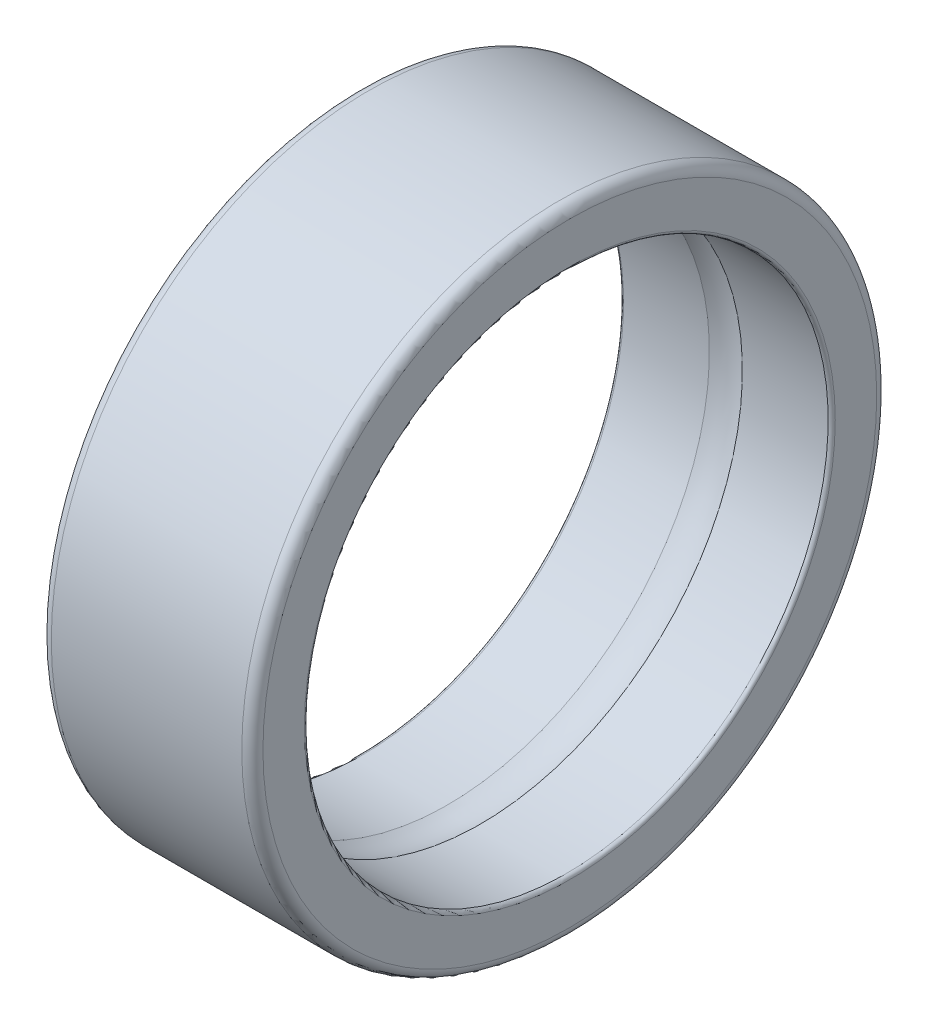
ISO-10303-21;
HEADER;
FILE_DESCRIPTION(('STEP AP214'),'2;1');
FILE_NAME('part.step','',(''),(''),'','','');
FILE_SCHEMA(('AUTOMOTIVE_DESIGN { 1 0 10303 214 1 1 1 1 }'));
ENDSEC;
DATA;
#1=APPLICATION_CONTEXT('core data for automotive mechanical design processes');
#2=APPLICATION_PROTOCOL_DEFINITION('international standard','automotive_design',2000,#1);
#3=PRODUCT_CONTEXT('',#1,'mechanical');
#4=PRODUCT('Part','Part','',(#3));
#5=PRODUCT_RELATED_PRODUCT_CATEGORY('part','',(#4));
#6=PRODUCT_DEFINITION_FORMATION('','',#4);
#7=PRODUCT_DEFINITION_CONTEXT('part definition',#1,'design');
#8=PRODUCT_DEFINITION('design','',#6,#7);
#9=PRODUCT_DEFINITION_SHAPE('','',#8);
#10=(LENGTH_UNIT() NAMED_UNIT(*) SI_UNIT(.MILLI.,.METRE.));
#11=(NAMED_UNIT(*) PLANE_ANGLE_UNIT() SI_UNIT($,.RADIAN.));
#12=(NAMED_UNIT(*) SI_UNIT($,.STERADIAN.) SOLID_ANGLE_UNIT());
#13=UNCERTAINTY_MEASURE_WITH_UNIT(LENGTH_MEASURE(1.E-05),#10,'distance_accuracy_value','');
#14=(GEOMETRIC_REPRESENTATION_CONTEXT(3) GLOBAL_UNCERTAINTY_ASSIGNED_CONTEXT((#13)) GLOBAL_UNIT_ASSIGNED_CONTEXT((#10,
#11,#12)) REPRESENTATION_CONTEXT('',''));
#15=CARTESIAN_POINT('',(0.,0.,0.));
#16=DIRECTION('',(0.,0.,1.));
#17=DIRECTION('',(1.,0.,0.));
#18=AXIS2_PLACEMENT_3D('',#15,#16,#17);
#19=CARTESIAN_POINT('',(0.0666666666667272,0.,0.));
#20=DIRECTION('',(-1.,0.,0.));
#21=DIRECTION('',(0.,0.,1.));
#22=AXIS2_PLACEMENT_3D('',#19,#20,#21);
#23=TOROIDAL_SURFACE('',#22,5.01666666666673,0.0666666666667271);
#24=CARTESIAN_POINT('',(0.0666666666666671,0.,0.));
#25=DIRECTION('',(-1.,0.,0.));
#26=DIRECTION('',(0.,0.,1.));
#27=AXIS2_PLACEMENT_3D('',#24,#25,#26);
#28=CIRCLE('',#27,4.95);
#29=CARTESIAN_POINT('',(0.0666666666666671,0.,4.95));
#30=VERTEX_POINT('',#29);
#31=EDGE_CURVE('E10',#30,#30,#28,.T.);
#32=ORIENTED_EDGE('',*,*,#31,.F.);
#33=EDGE_LOOP('',(#32));
#34=FACE_BOUND('',#33,.T.);
#35=CARTESIAN_POINT('',(0.,0.,0.));
#36=DIRECTION('',(-1.,0.,0.));
#37=DIRECTION('',(0.,0.,1.));
#38=AXIS2_PLACEMENT_3D('',#35,#36,#37);
#39=CIRCLE('',#38,5.0166666666667);
#40=CARTESIAN_POINT('',(0.,0.,5.0166666666667));
#41=VERTEX_POINT('',#40);
#42=EDGE_CURVE('E65',#41,#41,#39,.T.);
#43=ORIENTED_EDGE('',*,*,#42,.T.);
#44=EDGE_LOOP('',(#43));
#45=FACE_BOUND('',#44,.T.);
#46=ADVANCED_FACE('F31',(#34,#45),#23,.T.);
#47=CARTESIAN_POINT('',(4.,0.,0.));
#48=DIRECTION('',(-1.,0.,0.));
#49=DIRECTION('',(0.,0.,1.));
#50=AXIS2_PLACEMENT_3D('',#47,#48,#49);
#51=CYLINDRICAL_SURFACE('',#50,4.95);
#52=CARTESIAN_POINT('',(1.6877501000801,0.,0.));
#53=DIRECTION('',(-1.,0.,0.));
#54=DIRECTION('',(0.,0.,1.));
#55=AXIS2_PLACEMENT_3D('',#52,#53,#54);
#56=CIRCLE('',#55,4.95);
#57=CARTESIAN_POINT('',(1.6877501000801,0.,4.95));
#58=VERTEX_POINT('',#57);
#59=EDGE_CURVE('E37',#58,#58,#56,.T.);
#60=ORIENTED_EDGE('',*,*,#59,.F.);
#61=EDGE_LOOP('',(#60));
#62=FACE_BOUND('',#61,.T.);
#63=ORIENTED_EDGE('',*,*,#31,.T.);
#64=EDGE_LOOP('',(#63));
#65=FACE_BOUND('',#64,.T.);
#66=ADVANCED_FACE('F114',(#62,#65),#51,.F.);
#67=CARTESIAN_POINT('',(2.,0.,0.));
#68=DIRECTION('',(-1.,0.,0.));
#69=DIRECTION('',(0.,0.,1.));
#70=AXIS2_PLACEMENT_3D('',#67,#68,#69);
#71=TOROIDAL_SURFACE('',#70,4.00000000000012,0.999999999999884);
#72=CARTESIAN_POINT('',(2.3122498999199,0.,0.));
#73=DIRECTION('',(-1.,0.,0.));
#74=DIRECTION('',(0.,0.,1.));
#75=AXIS2_PLACEMENT_3D('',#72,#73,#74);
#76=CIRCLE('',#75,4.95);
#77=CARTESIAN_POINT('',(2.3122498999199,0.,4.95));
#78=VERTEX_POINT('',#77);
#79=EDGE_CURVE('E41',#78,#78,#76,.T.);
#80=ORIENTED_EDGE('',*,*,#79,.F.);
#81=EDGE_LOOP('',(#80));
#82=FACE_BOUND('',#81,.T.);
#83=ORIENTED_EDGE('',*,*,#59,.T.);
#84=EDGE_LOOP('',(#83));
#85=FACE_BOUND('',#84,.T.);
#86=ADVANCED_FACE('F109',(#82,#85),#71,.F.);
#87=CARTESIAN_POINT('',(4.,0.,0.));
#88=DIRECTION('',(-1.,0.,0.));
#89=DIRECTION('',(0.,0.,1.));
#90=AXIS2_PLACEMENT_3D('',#87,#88,#89);
#91=CYLINDRICAL_SURFACE('',#90,4.95);
#92=CARTESIAN_POINT('',(3.9333333333333,0.,0.));
#93=DIRECTION('',(-1.,0.,0.));
#94=DIRECTION('',(0.,0.,1.));
#95=AXIS2_PLACEMENT_3D('',#92,#93,#94);
#96=CIRCLE('',#95,4.95);
#97=CARTESIAN_POINT('',(3.9333333333333,0.,4.95));
#98=VERTEX_POINT('',#97);
#99=EDGE_CURVE('E45',#98,#98,#96,.T.);
#100=ORIENTED_EDGE('',*,*,#99,.F.);
#101=EDGE_LOOP('',(#100));
#102=FACE_BOUND('',#101,.T.);
#103=ORIENTED_EDGE('',*,*,#79,.T.);
#104=EDGE_LOOP('',(#103));
#105=FACE_BOUND('',#104,.T.);
#106=ADVANCED_FACE('F103',(#102,#105),#91,.F.);
#107=CARTESIAN_POINT('',(3.93333333333321,0.,0.));
#108=DIRECTION('',(-1.,0.,0.));
#109=DIRECTION('',(0.,0.,1.));
#110=AXIS2_PLACEMENT_3D('',#107,#108,#109);
#111=TOROIDAL_SURFACE('',#110,5.01666666666679,0.0666666666667912);
#112=CARTESIAN_POINT('',(4.,0.,0.));
#113=DIRECTION('',(-1.,0.,0.));
#114=DIRECTION('',(0.,0.,1.));
#115=AXIS2_PLACEMENT_3D('',#112,#113,#114);
#116=CIRCLE('',#115,5.0166666666667);
#117=CARTESIAN_POINT('',(4.,0.,5.0166666666667));
#118=VERTEX_POINT('',#117);
#119=EDGE_CURVE('E50',#118,#118,#116,.T.);
#120=ORIENTED_EDGE('',*,*,#119,.F.);
#121=EDGE_LOOP('',(#120));
#122=FACE_BOUND('',#121,.T.);
#123=ORIENTED_EDGE('',*,*,#99,.T.);
#124=EDGE_LOOP('',(#123));
#125=FACE_BOUND('',#124,.T.);
#126=ADVANCED_FACE('F97',(#122,#125),#111,.T.);
#127=CARTESIAN_POINT('',(4.,5.0166666666667,0.));
#128=DIRECTION('',(-1.,0.,0.));
#129=DIRECTION('',(0.,0.,1.));
#130=AXIS2_PLACEMENT_3D('',#127,#128,#129);
#131=PLANE('',#130);
#132=CARTESIAN_POINT('',(4.,0.,0.));
#133=DIRECTION('',(-1.,0.,0.));
#134=DIRECTION('',(0.,0.,1.));
#135=AXIS2_PLACEMENT_3D('',#132,#133,#134);
#136=CIRCLE('',#135,5.8);
#137=CARTESIAN_POINT('',(4.,0.,5.8));
#138=VERTEX_POINT('',#137);
#139=EDGE_CURVE('E53',#138,#138,#136,.T.);
#140=ORIENTED_EDGE('',*,*,#139,.F.);
#141=EDGE_LOOP('',(#140));
#142=FACE_BOUND('',#141,.T.);
#143=ORIENTED_EDGE('',*,*,#119,.T.);
#144=EDGE_LOOP('',(#143));
#145=FACE_BOUND('',#144,.T.);
#146=ADVANCED_FACE('F91',(#142,#145),#131,.F.);
#147=CARTESIAN_POINT('',(3.79999999999997,0.,0.));
#148=DIRECTION('',(-1.,0.,0.));
#149=DIRECTION('',(0.,0.,1.));
#150=AXIS2_PLACEMENT_3D('',#147,#148,#149);
#151=TOROIDAL_SURFACE('',#150,5.79999999999997,0.200000000000034);
#152=CARTESIAN_POINT('',(3.8,0.,0.));
#153=DIRECTION('',(-1.,0.,0.));
#154=DIRECTION('',(0.,0.,1.));
#155=AXIS2_PLACEMENT_3D('',#152,#153,#154);
#156=CIRCLE('',#155,6.);
#157=CARTESIAN_POINT('',(3.8,0.,6.));
#158=VERTEX_POINT('',#157);
#159=EDGE_CURVE('E56',#158,#158,#156,.T.);
#160=ORIENTED_EDGE('',*,*,#159,.F.);
#161=EDGE_LOOP('',(#160));
#162=FACE_BOUND('',#161,.T.);
#163=ORIENTED_EDGE('',*,*,#139,.T.);
#164=EDGE_LOOP('',(#163));
#165=FACE_BOUND('',#164,.T.);
#166=ADVANCED_FACE('F85',(#162,#165),#151,.T.);
#167=CARTESIAN_POINT('',(4.,0.,0.));
#168=DIRECTION('',(-1.,0.,0.));
#169=DIRECTION('',(0.,0.,1.));
#170=AXIS2_PLACEMENT_3D('',#167,#168,#169);
#171=CYLINDRICAL_SURFACE('',#170,6.);
#172=CARTESIAN_POINT('',(0.2,0.,0.));
#173=DIRECTION('',(-1.,0.,0.));
#174=DIRECTION('',(0.,0.,1.));
#175=AXIS2_PLACEMENT_3D('',#172,#173,#174);
#176=CIRCLE('',#175,6.);
#177=CARTESIAN_POINT('',(0.2,0.,6.));
#178=VERTEX_POINT('',#177);
#179=EDGE_CURVE('E59',#178,#178,#176,.T.);
#180=ORIENTED_EDGE('',*,*,#179,.F.);
#181=EDGE_LOOP('',(#180));
#182=FACE_BOUND('',#181,.T.);
#183=ORIENTED_EDGE('',*,*,#159,.T.);
#184=EDGE_LOOP('',(#183));
#185=FACE_BOUND('',#184,.T.);
#186=ADVANCED_FACE('F79',(#182,#185),#171,.T.);
#187=CARTESIAN_POINT('',(0.200000000000018,0.,0.));
#188=DIRECTION('',(-1.,0.,0.));
#189=DIRECTION('',(0.,0.,1.));
#190=AXIS2_PLACEMENT_3D('',#187,#188,#189);
#191=TOROIDAL_SURFACE('',#190,5.79999999999998,0.200000000000018);
#192=CARTESIAN_POINT('',(0.,0.,0.));
#193=DIRECTION('',(-1.,0.,0.));
#194=DIRECTION('',(0.,0.,1.));
#195=AXIS2_PLACEMENT_3D('',#192,#193,#194);
#196=CIRCLE('',#195,5.8);
#197=CARTESIAN_POINT('',(0.,0.,5.8));
#198=VERTEX_POINT('',#197);
#199=EDGE_CURVE('E62',#198,#198,#196,.T.);
#200=ORIENTED_EDGE('',*,*,#199,.F.);
#201=EDGE_LOOP('',(#200));
#202=FACE_BOUND('',#201,.T.);
#203=ORIENTED_EDGE('',*,*,#179,.T.);
#204=EDGE_LOOP('',(#203));
#205=FACE_BOUND('',#204,.T.);
#206=ADVANCED_FACE('F73',(#202,#205),#191,.T.);
#207=CARTESIAN_POINT('',(0.,5.8,0.));
#208=DIRECTION('',(1.,0.,0.));
#209=DIRECTION('',(0.,0.,-1.));
#210=AXIS2_PLACEMENT_3D('',#207,#208,#209);
#211=PLANE('',#210);
#212=ORIENTED_EDGE('',*,*,#42,.F.);
#213=EDGE_LOOP('',(#212));
#214=FACE_BOUND('',#213,.T.);
#215=ORIENTED_EDGE('',*,*,#199,.T.);
#216=EDGE_LOOP('',(#215));
#217=FACE_BOUND('',#216,.T.);
#218=ADVANCED_FACE('F70',(#214,#217),#211,.F.);
#219=CLOSED_SHELL('',(#46,#66,#86,#106,#126,#146,#166,#186,#206,#218));
#220=MANIFOLD_SOLID_BREP('B2',#219);
#221=ADVANCED_BREP_SHAPE_REPRESENTATION('',(#18,#220),#14);
#222=SHAPE_DEFINITION_REPRESENTATION(#9,#221);
ENDSEC;
END-ISO-10303-21;
